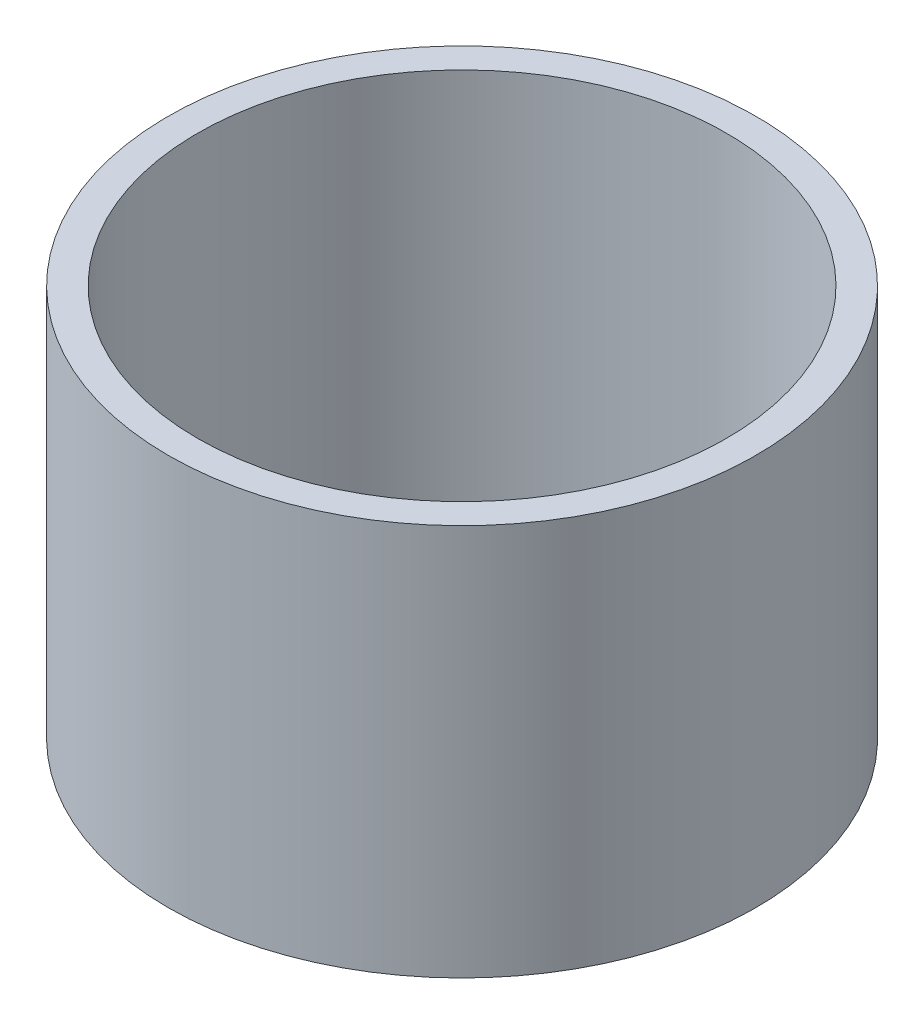
ISO-10303-21;
HEADER;
FILE_DESCRIPTION(('STEP AP214'),'2;1');
FILE_NAME('part.step','',(''),(''),'','','');
FILE_SCHEMA(('AUTOMOTIVE_DESIGN { 1 0 10303 214 1 1 1 1 }'));
ENDSEC;
DATA;
#1=APPLICATION_CONTEXT('core data for automotive mechanical design processes');
#2=APPLICATION_PROTOCOL_DEFINITION('international standard','automotive_design',2000,#1);
#3=PRODUCT_CONTEXT('',#1,'mechanical');
#4=PRODUCT('Part','Part','',(#3));
#5=PRODUCT_RELATED_PRODUCT_CATEGORY('part','',(#4));
#6=PRODUCT_DEFINITION_FORMATION('','',#4);
#7=PRODUCT_DEFINITION_CONTEXT('part definition',#1,'design');
#8=PRODUCT_DEFINITION('design','',#6,#7);
#9=PRODUCT_DEFINITION_SHAPE('','',#8);
#10=(LENGTH_UNIT() NAMED_UNIT(*) SI_UNIT(.MILLI.,.METRE.));
#11=(NAMED_UNIT(*) PLANE_ANGLE_UNIT() SI_UNIT($,.RADIAN.));
#12=(NAMED_UNIT(*) SI_UNIT($,.STERADIAN.) SOLID_ANGLE_UNIT());
#13=UNCERTAINTY_MEASURE_WITH_UNIT(LENGTH_MEASURE(1.E-05),#10,'distance_accuracy_value','');
#14=(GEOMETRIC_REPRESENTATION_CONTEXT(3) GLOBAL_UNCERTAINTY_ASSIGNED_CONTEXT((#13)) GLOBAL_UNIT_ASSIGNED_CONTEXT((#10,
#11,#12)) REPRESENTATION_CONTEXT('',''));
#15=CARTESIAN_POINT('',(0.,0.,0.));
#16=DIRECTION('',(0.,0.,1.));
#17=DIRECTION('',(1.,0.,0.));
#18=AXIS2_PLACEMENT_3D('',#15,#16,#17);
#19=CARTESIAN_POINT('',(0.,20.,0.));
#20=DIRECTION('',(0.,1.,0.));
#21=DIRECTION('',(0.,0.,1.));
#22=AXIS2_PLACEMENT_3D('',#19,#20,#21);
#23=PLANE('',#22);
#24=CARTESIAN_POINT('',(0.,20.,0.));
#25=DIRECTION('',(0.,1.,0.));
#26=DIRECTION('',(0.,0.,1.));
#27=AXIS2_PLACEMENT_3D('',#24,#25,#26);
#28=CIRCLE('',#27,15.);
#29=CARTESIAN_POINT('',(0.,20.,15.));
#30=VERTEX_POINT('',#29);
#31=EDGE_CURVE('E10',#30,#30,#28,.T.);
#32=ORIENTED_EDGE('',*,*,#31,.T.);
#33=EDGE_LOOP('',(#32));
#34=FACE_BOUND('',#33,.T.);
#35=CARTESIAN_POINT('',(0.,20.,0.));
#36=DIRECTION('',(0.,1.,0.));
#37=DIRECTION('',(0.,0.,1.));
#38=AXIS2_PLACEMENT_3D('',#35,#36,#37);
#39=CIRCLE('',#38,13.5);
#40=CARTESIAN_POINT('',(0.,20.,13.5));
#41=VERTEX_POINT('',#40);
#42=EDGE_CURVE('E43',#41,#41,#39,.T.);
#43=ORIENTED_EDGE('',*,*,#42,.F.);
#44=EDGE_LOOP('',(#43));
#45=FACE_BOUND('',#44,.T.);
#46=ADVANCED_FACE('F32',(#34,#45),#23,.T.);
#47=CARTESIAN_POINT('',(0.,0.,0.));
#48=DIRECTION('',(0.,1.,0.));
#49=DIRECTION('',(0.,0.,1.));
#50=AXIS2_PLACEMENT_3D('',#47,#48,#49);
#51=PLANE('',#50);
#52=CARTESIAN_POINT('',(0.,0.,0.));
#53=DIRECTION('',(0.,1.,0.));
#54=DIRECTION('',(0.,0.,1.));
#55=AXIS2_PLACEMENT_3D('',#52,#53,#54);
#56=CIRCLE('',#55,15.);
#57=CARTESIAN_POINT('',(0.,0.,15.));
#58=VERTEX_POINT('',#57);
#59=EDGE_CURVE('E36',#58,#58,#56,.T.);
#60=ORIENTED_EDGE('',*,*,#59,.F.);
#61=EDGE_LOOP('',(#60));
#62=FACE_BOUND('',#61,.T.);
#63=CARTESIAN_POINT('',(0.,0.,0.));
#64=DIRECTION('',(0.,1.,0.));
#65=DIRECTION('',(0.,0.,1.));
#66=AXIS2_PLACEMENT_3D('',#63,#64,#65);
#67=CIRCLE('',#66,13.5);
#68=CARTESIAN_POINT('',(0.,0.,13.5));
#69=VERTEX_POINT('',#68);
#70=EDGE_CURVE('E45',#69,#69,#67,.T.);
#71=ORIENTED_EDGE('',*,*,#70,.T.);
#72=EDGE_LOOP('',(#71));
#73=FACE_BOUND('',#72,.T.);
#74=ADVANCED_FACE('F55',(#62,#73),#51,.F.);
#75=CARTESIAN_POINT('',(0.,20.,0.));
#76=DIRECTION('',(0.,-1.,0.));
#77=DIRECTION('',(0.,0.,-1.));
#78=AXIS2_PLACEMENT_3D('',#75,#76,#77);
#79=CYLINDRICAL_SURFACE('',#78,15.);
#80=ORIENTED_EDGE('',*,*,#31,.F.);
#81=EDGE_LOOP('',(#80));
#82=FACE_BOUND('',#81,.T.);
#83=ORIENTED_EDGE('',*,*,#59,.T.);
#84=EDGE_LOOP('',(#83));
#85=FACE_BOUND('',#84,.T.);
#86=ADVANCED_FACE('F34',(#82,#85),#79,.T.);
#87=CARTESIAN_POINT('',(0.,20.,0.));
#88=DIRECTION('',(0.,-1.,0.));
#89=DIRECTION('',(0.,0.,-1.));
#90=AXIS2_PLACEMENT_3D('',#87,#88,#89);
#91=CYLINDRICAL_SURFACE('',#90,13.5);
#92=ORIENTED_EDGE('',*,*,#42,.T.);
#93=EDGE_LOOP('',(#92));
#94=FACE_BOUND('',#93,.T.);
#95=ORIENTED_EDGE('',*,*,#70,.F.);
#96=EDGE_LOOP('',(#95));
#97=FACE_BOUND('',#96,.T.);
#98=ADVANCED_FACE('F51',(#94,#97),#91,.F.);
#99=CLOSED_SHELL('',(#46,#74,#86,#98));
#100=MANIFOLD_SOLID_BREP('B2',#99);
#101=ADVANCED_BREP_SHAPE_REPRESENTATION('',(#18,#100),#14);
#102=SHAPE_DEFINITION_REPRESENTATION(#9,#101);
ENDSEC;
END-ISO-10303-21;
